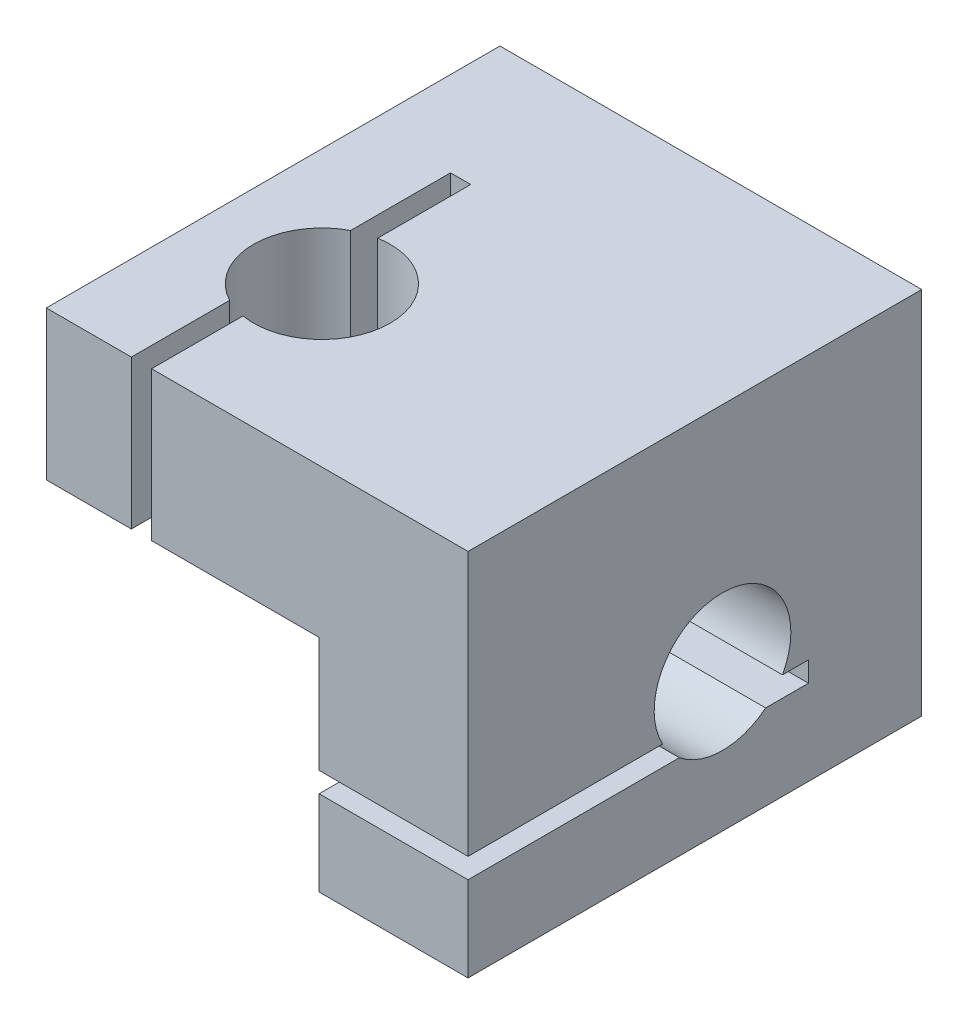
ISO-10303-21;
HEADER;
FILE_DESCRIPTION(('STEP AP214'),'2;1');
FILE_NAME('part.step','',(''),(''),'','','');
FILE_SCHEMA(('AUTOMOTIVE_DESIGN { 1 0 10303 214 1 1 1 1 }'));
ENDSEC;
DATA;
#1=APPLICATION_CONTEXT('core data for automotive mechanical design processes');
#2=APPLICATION_PROTOCOL_DEFINITION('international standard','automotive_design',2000,#1);
#3=PRODUCT_CONTEXT('',#1,'mechanical');
#4=PRODUCT('Part','Part','',(#3));
#5=PRODUCT_RELATED_PRODUCT_CATEGORY('part','',(#4));
#6=PRODUCT_DEFINITION_FORMATION('','',#4);
#7=PRODUCT_DEFINITION_CONTEXT('part definition',#1,'design');
#8=PRODUCT_DEFINITION('design','',#6,#7);
#9=PRODUCT_DEFINITION_SHAPE('','',#8);
#10=(LENGTH_UNIT() NAMED_UNIT(*) SI_UNIT(.MILLI.,.METRE.));
#11=(NAMED_UNIT(*) PLANE_ANGLE_UNIT() SI_UNIT($,.RADIAN.));
#12=(NAMED_UNIT(*) SI_UNIT($,.STERADIAN.) SOLID_ANGLE_UNIT());
#13=UNCERTAINTY_MEASURE_WITH_UNIT(LENGTH_MEASURE(1.E-05),#10,'distance_accuracy_value','');
#14=(GEOMETRIC_REPRESENTATION_CONTEXT(3) GLOBAL_UNCERTAINTY_ASSIGNED_CONTEXT((#13)) GLOBAL_UNIT_ASSIGNED_CONTEXT((#10,
#11,#12)) REPRESENTATION_CONTEXT('',''));
#15=CARTESIAN_POINT('',(0.,0.,0.));
#16=DIRECTION('',(0.,0.,1.));
#17=DIRECTION('',(1.,0.,0.));
#18=AXIS2_PLACEMENT_3D('',#15,#16,#17);
#19=CARTESIAN_POINT('',(0.,0.,42.65));
#20=DIRECTION('',(0.,0.,1.));
#21=DIRECTION('',(1.,0.,0.));
#22=AXIS2_PLACEMENT_3D('',#19,#20,#21);
#23=PLANE('',#22);
#24=DIRECTION('',(-1.,0.,0.));
#25=VECTOR('',#24,1.);
#26=CARTESIAN_POINT('',(42.65,-26.73,42.65));
#27=LINE('',#26,#25);
#28=CARTESIAN_POINT('',(14.,-26.73,42.65));
#29=VERTEX_POINT('',#28);
#30=CARTESIAN_POINT('',(0.,-26.73,42.65));
#31=VERTEX_POINT('',#30);
#32=EDGE_CURVE('E259',#29,#31,#27,.T.);
#33=ORIENTED_EDGE('',*,*,#32,.T.);
#34=DIRECTION('',(0.,-1.,0.));
#35=VECTOR('',#34,1.);
#36=CARTESIAN_POINT('',(0.,0.,42.65));
#37=LINE('',#36,#35);
#38=CARTESIAN_POINT('',(0.,-34.73,42.65));
#39=VERTEX_POINT('',#38);
#40=EDGE_CURVE('E346',#31,#39,#37,.T.);
#41=ORIENTED_EDGE('',*,*,#40,.T.);
#42=DIRECTION('',(1.,0.,0.));
#43=VECTOR('',#42,1.);
#44=CARTESIAN_POINT('',(0.,-34.73,42.65));
#45=LINE('',#44,#43);
#46=CARTESIAN_POINT('',(14.,-34.73,42.65));
#47=VERTEX_POINT('',#46);
#48=EDGE_CURVE('E351',#39,#47,#45,.T.);
#49=ORIENTED_EDGE('',*,*,#48,.T.);
#50=DIRECTION('',(0.,-1.,0.));
#51=VECTOR('',#50,1.);
#52=CARTESIAN_POINT('',(14.,0.,42.65));
#53=LINE('',#52,#51);
#54=EDGE_CURVE('E355',#29,#47,#53,.T.);
#55=ORIENTED_EDGE('',*,*,#54,.F.);
#56=EDGE_LOOP('',(#33,#41,#49,#55));
#57=FACE_BOUND('',#56,.T.);
#58=ADVANCED_FACE('F47',(#57),#23,.T.);
#59=CARTESIAN_POINT('',(42.65,-21.745,18.725));
#60=DIRECTION('',(-1.,0.,0.));
#61=DIRECTION('',(0.,-1.,0.));
#62=AXIS2_PLACEMENT_3D('',#59,#60,#61);
#63=CYLINDRICAL_SURFACE('',#62,6.425);
#64=CARTESIAN_POINT('',(0.,-21.745,18.725));
#65=DIRECTION('',(-1.,0.,0.));
#66=DIRECTION('',(0.,-1.,0.));
#67=AXIS2_PLACEMENT_3D('',#64,#65,#66);
#68=CIRCLE('',#67,6.425);
#69=CARTESIAN_POINT('',(0.,-26.73,14.6715570190269));
#70=VERTEX_POINT('',#69);
#71=CARTESIAN_POINT('',(0.,-26.73,22.7784429809731));
#72=VERTEX_POINT('',#71);
#73=EDGE_CURVE('E278',#70,#72,#68,.T.);
#74=ORIENTED_EDGE('',*,*,#73,.T.);
#75=DIRECTION('',(-1.,0.,0.));
#76=VECTOR('',#75,1.);
#77=CARTESIAN_POINT('',(42.65,-26.73,22.7784429809731));
#78=LINE('',#77,#76);
#79=CARTESIAN_POINT('',(14.,-26.73,22.7784429809731));
#80=VERTEX_POINT('',#79);
#81=EDGE_CURVE('E56',#72,#80,#78,.F.);
#82=ORIENTED_EDGE('',*,*,#81,.T.);
#83=CARTESIAN_POINT('',(14.,-21.745,18.725));
#84=DIRECTION('',(1.,0.,0.));
#85=DIRECTION('',(0.,1.,0.));
#86=AXIS2_PLACEMENT_3D('',#83,#84,#85);
#87=CIRCLE('',#86,6.425);
#88=CARTESIAN_POINT('',(14.,-26.73,14.6715570190269));
#89=VERTEX_POINT('',#88);
#90=EDGE_CURVE('E424',#80,#89,#87,.T.);
#91=ORIENTED_EDGE('',*,*,#90,.T.);
#92=DIRECTION('',(-1.,0.,0.));
#93=VECTOR('',#92,1.);
#94=CARTESIAN_POINT('',(42.65,-26.73,14.6715570190269));
#95=LINE('',#94,#93);
#96=EDGE_CURVE('E430',#89,#70,#95,.T.);
#97=ORIENTED_EDGE('',*,*,#96,.T.);
#98=EDGE_LOOP('',(#74,#82,#91,#97));
#99=FACE_BOUND('',#98,.T.);
#100=ADVANCED_FACE('F438',(#99),#63,.F.);
#101=DIRECTION('',(0.,-1.,0.));
#102=VECTOR('',#101,1.);
#103=CARTESIAN_POINT('',(-17.65,28.65,42.65));
#104=LINE('',#103,#102);
#105=CARTESIAN_POINT('',(-17.65,0.,42.65));
#106=VERTEX_POINT('',#105);
#107=CARTESIAN_POINT('',(-17.65,-14.,42.65));
#108=VERTEX_POINT('',#107);
#109=EDGE_CURVE('E296',#106,#108,#104,.T.);
#110=ORIENTED_EDGE('',*,*,#109,.F.);
#111=DIRECTION('',(-1.,0.,0.));
#112=VECTOR('',#111,1.);
#113=CARTESIAN_POINT('',(0.,0.,42.65));
#114=LINE('',#113,#112);
#115=CARTESIAN_POINT('',(-25.65,0.,42.65));
#116=VERTEX_POINT('',#115);
#117=EDGE_CURVE('E337',#106,#116,#114,.T.);
#118=ORIENTED_EDGE('',*,*,#117,.T.);
#119=DIRECTION('',(0.,-1.,0.));
#120=VECTOR('',#119,1.);
#121=CARTESIAN_POINT('',(-25.65,0.,42.65));
#122=LINE('',#121,#120);
#123=CARTESIAN_POINT('',(-25.65,-14.,42.65));
#124=VERTEX_POINT('',#123);
#125=EDGE_CURVE('E336',#116,#124,#122,.T.);
#126=ORIENTED_EDGE('',*,*,#125,.T.);
#127=DIRECTION('',(-1.,0.,0.));
#128=VECTOR('',#127,1.);
#129=CARTESIAN_POINT('',(0.,-14.,42.65));
#130=LINE('',#129,#128);
#131=EDGE_CURVE('E341',#108,#124,#130,.T.);
#132=ORIENTED_EDGE('',*,*,#131,.F.);
#133=EDGE_LOOP('',(#110,#118,#126,#132));
#134=FACE_BOUND('',#133,.T.);
#135=ADVANCED_FACE('F517',(#134),#23,.T.);
#136=CARTESIAN_POINT('',(-14.665,28.65,27.725));
#137=DIRECTION('',(0.,-1.,0.));
#138=DIRECTION('',(1.,0.,0.));
#139=AXIS2_PLACEMENT_3D('',#136,#137,#138);
#140=CYLINDRICAL_SURFACE('',#139,6.425);
#141=CARTESIAN_POINT('',(-14.665,-14.,27.725));
#142=DIRECTION('',(0.,-1.,0.));
#143=DIRECTION('',(1.,0.,0.));
#144=AXIS2_PLACEMENT_3D('',#141,#142,#143);
#145=CIRCLE('',#144,6.425);
#146=CARTESIAN_POINT('',(-17.65,-14.,33.4144990992178));
#147=VERTEX_POINT('',#146);
#148=CARTESIAN_POINT('',(-17.65,-14.,22.0355009007822));
#149=VERTEX_POINT('',#148);
#150=EDGE_CURVE('E326',#147,#149,#145,.T.);
#151=ORIENTED_EDGE('',*,*,#150,.T.);
#152=DIRECTION('',(0.,-1.,0.));
#153=VECTOR('',#152,1.);
#154=CARTESIAN_POINT('',(-17.65,28.65,22.0355009007822));
#155=LINE('',#154,#153);
#156=CARTESIAN_POINT('',(-17.65,0.,22.0355009007822));
#157=VERTEX_POINT('',#156);
#158=EDGE_CURVE('E415',#149,#157,#155,.F.);
#159=ORIENTED_EDGE('',*,*,#158,.T.);
#160=CARTESIAN_POINT('',(-14.665,0.,27.725));
#161=DIRECTION('',(0.,-1.,0.));
#162=DIRECTION('',(1.,0.,0.));
#163=AXIS2_PLACEMENT_3D('',#160,#161,#162);
#164=CIRCLE('',#163,6.425);
#165=CARTESIAN_POINT('',(-17.65,0.,33.4144990992178));
#166=VERTEX_POINT('',#165);
#167=EDGE_CURVE('E331',#166,#157,#164,.T.);
#168=ORIENTED_EDGE('',*,*,#167,.F.);
#169=DIRECTION('',(0.,-1.,0.));
#170=VECTOR('',#169,1.);
#171=CARTESIAN_POINT('',(-17.65,28.65,33.4144990992178));
#172=LINE('',#171,#170);
#173=EDGE_CURVE('E411',#166,#147,#172,.T.);
#174=ORIENTED_EDGE('',*,*,#173,.T.);
#175=EDGE_LOOP('',(#151,#159,#168,#174));
#176=FACE_BOUND('',#175,.T.);
#177=ADVANCED_FACE('F510',(#176),#140,.F.);
#178=CARTESIAN_POINT('',(0.,0.,42.65));
#179=DIRECTION('',(0.,-1.,0.));
#180=DIRECTION('',(1.,0.,0.));
#181=AXIS2_PLACEMENT_3D('',#178,#179,#180);
#182=PLANE('',#181);
#183=ORIENTED_EDGE('',*,*,#117,.F.);
#184=DIRECTION('',(0.,0.,-1.));
#185=VECTOR('',#184,1.);
#186=CARTESIAN_POINT('',(-17.65,0.,42.65));
#187=LINE('',#186,#185);
#188=EDGE_CURVE('E313',#106,#166,#187,.T.);
#189=ORIENTED_EDGE('',*,*,#188,.T.);
#190=ORIENTED_EDGE('',*,*,#167,.T.);
#191=CARTESIAN_POINT('',(-17.65,0.,12.65));
#192=VERTEX_POINT('',#191);
#193=EDGE_CURVE('E317',#157,#192,#187,.T.);
#194=ORIENTED_EDGE('',*,*,#193,.T.);
#195=DIRECTION('',(1.,0.,0.));
#196=VECTOR('',#195,1.);
#197=CARTESIAN_POINT('',(0.,0.,12.65));
#198=LINE('',#197,#196);
#199=CARTESIAN_POINT('',(-15.75,0.,12.65));
#200=VERTEX_POINT('',#199);
#201=EDGE_CURVE('E318',#192,#200,#198,.T.);
#202=ORIENTED_EDGE('',*,*,#201,.T.);
#203=DIRECTION('',(0.,0.,1.));
#204=VECTOR('',#203,1.);
#205=CARTESIAN_POINT('',(-15.75,0.,42.65));
#206=LINE('',#205,#204);
#207=CARTESIAN_POINT('',(-15.75,0.,21.3922754678575));
#208=VERTEX_POINT('',#207);
#209=EDGE_CURVE('E299',#200,#208,#206,.T.);
#210=ORIENTED_EDGE('',*,*,#209,.T.);
#211=CARTESIAN_POINT('',(-15.75,0.,34.0577245321425));
#212=VERTEX_POINT('',#211);
#213=EDGE_CURVE('E327',#208,#212,#164,.T.);
#214=ORIENTED_EDGE('',*,*,#213,.T.);
#215=CARTESIAN_POINT('',(-15.75,0.,42.65));
#216=VERTEX_POINT('',#215);
#217=EDGE_CURVE('E312',#212,#216,#206,.T.);
#218=ORIENTED_EDGE('',*,*,#217,.T.);
#219=CARTESIAN_POINT('',(14.,0.,42.65));
#220=VERTEX_POINT('',#219);
#221=EDGE_CURVE('E332',#220,#216,#114,.T.);
#222=ORIENTED_EDGE('',*,*,#221,.F.);
#223=DIRECTION('',(0.,0.,-1.));
#224=VECTOR('',#223,1.);
#225=CARTESIAN_POINT('',(14.,0.,42.65));
#226=LINE('',#225,#224);
#227=CARTESIAN_POINT('',(14.,0.,0.));
#228=VERTEX_POINT('',#227);
#229=EDGE_CURVE('E360',#220,#228,#226,.T.);
#230=ORIENTED_EDGE('',*,*,#229,.T.);
#231=DIRECTION('',(-1.,0.,0.));
#232=VECTOR('',#231,1.);
#233=CARTESIAN_POINT('',(0.,0.,0.));
#234=LINE('',#233,#232);
#235=CARTESIAN_POINT('',(-25.65,0.,0.));
#236=VERTEX_POINT('',#235);
#237=EDGE_CURVE('E361',#228,#236,#234,.T.);
#238=ORIENTED_EDGE('',*,*,#237,.T.);
#239=DIRECTION('',(0.,0.,-1.));
#240=VECTOR('',#239,1.);
#241=CARTESIAN_POINT('',(-25.65,0.,42.65));
#242=LINE('',#241,#240);
#243=EDGE_CURVE('E399',#116,#236,#242,.T.);
#244=ORIENTED_EDGE('',*,*,#243,.F.);
#245=EDGE_LOOP('',(#183,#189,#190,#194,#202,#210,#214,#218,#222,#230,#238,#244));
#246=FACE_BOUND('',#245,.T.);
#247=ADVANCED_FACE('F49',(#246),#182,.F.);
#248=CARTESIAN_POINT('',(-25.65,0.,42.65));
#249=DIRECTION('',(1.,0.,0.));
#250=DIRECTION('',(0.,1.,0.));
#251=AXIS2_PLACEMENT_3D('',#248,#249,#250);
#252=PLANE('',#251);
#253=DIRECTION('',(0.,-1.,0.));
#254=VECTOR('',#253,1.);
#255=CARTESIAN_POINT('',(-25.65,0.,0.));
#256=LINE('',#255,#254);
#257=CARTESIAN_POINT('',(-25.65,-14.,0.));
#258=VERTEX_POINT('',#257);
#259=EDGE_CURVE('E365',#236,#258,#256,.T.);
#260=ORIENTED_EDGE('',*,*,#259,.T.);
#261=DIRECTION('',(0.,0.,-1.));
#262=VECTOR('',#261,1.);
#263=CARTESIAN_POINT('',(-25.65,-14.,42.65));
#264=LINE('',#263,#262);
#265=EDGE_CURVE('E396',#124,#258,#264,.T.);
#266=ORIENTED_EDGE('',*,*,#265,.F.);
#267=ORIENTED_EDGE('',*,*,#125,.F.);
#268=ORIENTED_EDGE('',*,*,#243,.T.);
#269=EDGE_LOOP('',(#260,#266,#267,#268));
#270=FACE_BOUND('',#269,.T.);
#271=ADVANCED_FACE('F542',(#270),#252,.F.);
#272=CARTESIAN_POINT('',(0.,-14.,42.65));
#273=DIRECTION('',(0.,-1.,0.));
#274=DIRECTION('',(1.,0.,0.));
#275=AXIS2_PLACEMENT_3D('',#272,#273,#274);
#276=PLANE('',#275);
#277=DIRECTION('',(0.,0.,-1.));
#278=VECTOR('',#277,1.);
#279=CARTESIAN_POINT('',(-17.65,-14.,42.65));
#280=LINE('',#279,#278);
#281=EDGE_CURVE('E283',#108,#147,#280,.T.);
#282=ORIENTED_EDGE('',*,*,#281,.F.);
#283=ORIENTED_EDGE('',*,*,#131,.T.);
#284=ORIENTED_EDGE('',*,*,#265,.T.);
#285=DIRECTION('',(-1.,0.,0.));
#286=VECTOR('',#285,1.);
#287=CARTESIAN_POINT('',(0.,-14.,0.));
#288=LINE('',#287,#286);
#289=CARTESIAN_POINT('',(0.,-14.,0.));
#290=VERTEX_POINT('',#289);
#291=EDGE_CURVE('E369',#290,#258,#288,.T.);
#292=ORIENTED_EDGE('',*,*,#291,.F.);
#293=DIRECTION('',(0.,0.,-1.));
#294=VECTOR('',#293,1.);
#295=CARTESIAN_POINT('',(0.,-14.,42.65));
#296=LINE('',#295,#294);
#297=CARTESIAN_POINT('',(0.,-14.,42.65));
#298=VERTEX_POINT('',#297);
#299=EDGE_CURVE('E393',#298,#290,#296,.T.);
#300=ORIENTED_EDGE('',*,*,#299,.F.);
#301=CARTESIAN_POINT('',(-15.75,-14.,42.65));
#302=VERTEX_POINT('',#301);
#303=EDGE_CURVE('E342',#298,#302,#130,.T.);
#304=ORIENTED_EDGE('',*,*,#303,.T.);
#305=DIRECTION('',(0.,0.,1.));
#306=VECTOR('',#305,1.);
#307=CARTESIAN_POINT('',(-15.75,-14.,42.65));
#308=LINE('',#307,#306);
#309=CARTESIAN_POINT('',(-15.75,-14.,34.0577245321425));
#310=VERTEX_POINT('',#309);
#311=EDGE_CURVE('E291',#310,#302,#308,.T.);
#312=ORIENTED_EDGE('',*,*,#311,.F.);
#313=CARTESIAN_POINT('',(-15.75,-14.,21.3922754678575));
#314=VERTEX_POINT('',#313);
#315=EDGE_CURVE('E322',#314,#310,#145,.T.);
#316=ORIENTED_EDGE('',*,*,#315,.F.);
#317=CARTESIAN_POINT('',(-15.75,-14.,12.65));
#318=VERTEX_POINT('',#317);
#319=EDGE_CURVE('E292',#318,#314,#308,.T.);
#320=ORIENTED_EDGE('',*,*,#319,.F.);
#321=DIRECTION('',(1.,0.,0.));
#322=VECTOR('',#321,1.);
#323=CARTESIAN_POINT('',(-17.65,-14.,12.65));
#324=LINE('',#323,#322);
#325=CARTESIAN_POINT('',(-17.65,-14.,12.65));
#326=VERTEX_POINT('',#325);
#327=EDGE_CURVE('E286',#326,#318,#324,.T.);
#328=ORIENTED_EDGE('',*,*,#327,.F.);
#329=EDGE_CURVE('E287',#149,#326,#280,.T.);
#330=ORIENTED_EDGE('',*,*,#329,.F.);
#331=ORIENTED_EDGE('',*,*,#150,.F.);
#332=EDGE_LOOP('',(#282,#283,#284,#292,#300,#304,#312,#316,#320,#328,#330,#331));
#333=FACE_BOUND('',#332,.T.);
#334=ADVANCED_FACE('F462',(#333),#276,.T.);
#335=CARTESIAN_POINT('',(0.,0.,42.65));
#336=DIRECTION('',(1.,0.,0.));
#337=DIRECTION('',(0.,1.,0.));
#338=AXIS2_PLACEMENT_3D('',#335,#336,#337);
#339=PLANE('',#338);
#340=ORIENTED_EDGE('',*,*,#40,.F.);
#341=DIRECTION('',(0.,0.,1.));
#342=VECTOR('',#341,1.);
#343=CARTESIAN_POINT('',(0.,-26.73,42.65));
#344=LINE('',#343,#342);
#345=EDGE_CURVE('E254',#72,#31,#344,.T.);
#346=ORIENTED_EDGE('',*,*,#345,.F.);
#347=ORIENTED_EDGE('',*,*,#73,.F.);
#348=CARTESIAN_POINT('',(0.,-26.73,10.65));
#349=VERTEX_POINT('',#348);
#350=EDGE_CURVE('E255',#349,#70,#344,.T.);
#351=ORIENTED_EDGE('',*,*,#350,.F.);
#352=DIRECTION('',(0.,-1.,0.));
#353=VECTOR('',#352,1.);
#354=CARTESIAN_POINT('',(0.,-26.73,10.65));
#355=LINE('',#354,#353);
#356=CARTESIAN_POINT('',(0.,-24.83,10.65));
#357=VERTEX_POINT('',#356);
#358=EDGE_CURVE('E250',#357,#349,#355,.T.);
#359=ORIENTED_EDGE('',*,*,#358,.F.);
#360=DIRECTION('',(0.,0.,-1.));
#361=VECTOR('',#360,1.);
#362=CARTESIAN_POINT('',(0.,-24.83,42.65));
#363=LINE('',#362,#361);
#364=CARTESIAN_POINT('',(0.,-24.83,13.0890972329182));
#365=VERTEX_POINT('',#364);
#366=EDGE_CURVE('E247',#365,#357,#363,.T.);
#367=ORIENTED_EDGE('',*,*,#366,.F.);
#368=CARTESIAN_POINT('',(0.,-24.83,24.3609027670818));
#369=VERTEX_POINT('',#368);
#370=EDGE_CURVE('E282',#369,#365,#68,.T.);
#371=ORIENTED_EDGE('',*,*,#370,.F.);
#372=CARTESIAN_POINT('',(0.,-24.83,42.65));
#373=VERTEX_POINT('',#372);
#374=EDGE_CURVE('E63',#373,#369,#363,.T.);
#375=ORIENTED_EDGE('',*,*,#374,.F.);
#376=EDGE_CURVE('E347',#298,#373,#37,.T.);
#377=ORIENTED_EDGE('',*,*,#376,.F.);
#378=ORIENTED_EDGE('',*,*,#299,.T.);
#379=DIRECTION('',(0.,-1.,0.));
#380=VECTOR('',#379,1.);
#381=CARTESIAN_POINT('',(0.,0.,0.));
#382=LINE('',#381,#380);
#383=CARTESIAN_POINT('',(0.,-34.73,0.));
#384=VERTEX_POINT('',#383);
#385=EDGE_CURVE('E373',#290,#384,#382,.T.);
#386=ORIENTED_EDGE('',*,*,#385,.T.);
#387=DIRECTION('',(0.,0.,-1.));
#388=VECTOR('',#387,1.);
#389=CARTESIAN_POINT('',(0.,-34.73,42.65));
#390=LINE('',#389,#388);
#391=EDGE_CURVE('E389',#39,#384,#390,.T.);
#392=ORIENTED_EDGE('',*,*,#391,.F.);
#393=EDGE_LOOP('',(#340,#346,#347,#351,#359,#367,#371,#375,#377,#378,#386,#392));
#394=FACE_BOUND('',#393,.T.);
#395=ADVANCED_FACE('F490',(#394),#339,.F.);
#396=CARTESIAN_POINT('',(0.,-34.73,42.65));
#397=DIRECTION('',(0.,1.,0.));
#398=DIRECTION('',(0.,0.,1.));
#399=AXIS2_PLACEMENT_3D('',#396,#397,#398);
#400=PLANE('',#399);
#401=DIRECTION('',(1.,0.,0.));
#402=VECTOR('',#401,1.);
#403=CARTESIAN_POINT('',(0.,-34.73,0.));
#404=LINE('',#403,#402);
#405=CARTESIAN_POINT('',(14.,-34.73,0.));
#406=VERTEX_POINT('',#405);
#407=EDGE_CURVE('E376',#384,#406,#404,.T.);
#408=ORIENTED_EDGE('',*,*,#407,.T.);
#409=DIRECTION('',(0.,0.,-1.));
#410=VECTOR('',#409,1.);
#411=CARTESIAN_POINT('',(14.,-34.73,42.65));
#412=LINE('',#411,#410);
#413=EDGE_CURVE('E386',#47,#406,#412,.T.);
#414=ORIENTED_EDGE('',*,*,#413,.F.);
#415=ORIENTED_EDGE('',*,*,#48,.F.);
#416=ORIENTED_EDGE('',*,*,#391,.T.);
#417=EDGE_LOOP('',(#408,#414,#415,#416));
#418=FACE_BOUND('',#417,.T.);
#419=ADVANCED_FACE('F531',(#418),#400,.F.);
#420=CARTESIAN_POINT('',(14.,0.,42.65));
#421=DIRECTION('',(1.,0.,0.));
#422=DIRECTION('',(0.,1.,0.));
#423=AXIS2_PLACEMENT_3D('',#420,#421,#422);
#424=PLANE('',#423);
#425=DIRECTION('',(0.,0.,-1.));
#426=VECTOR('',#425,1.);
#427=CARTESIAN_POINT('',(14.,-26.73,42.65));
#428=LINE('',#427,#426);
#429=EDGE_CURVE('E277',#29,#80,#428,.T.);
#430=ORIENTED_EDGE('',*,*,#429,.F.);
#431=ORIENTED_EDGE('',*,*,#54,.T.);
#432=ORIENTED_EDGE('',*,*,#413,.T.);
#433=DIRECTION('',(0.,-1.,0.));
#434=VECTOR('',#433,1.);
#435=CARTESIAN_POINT('',(14.,0.,0.));
#436=LINE('',#435,#434);
#437=EDGE_CURVE('E380',#228,#406,#436,.T.);
#438=ORIENTED_EDGE('',*,*,#437,.F.);
#439=ORIENTED_EDGE('',*,*,#229,.F.);
#440=CARTESIAN_POINT('',(14.,-24.83,42.65));
#441=VERTEX_POINT('',#440);
#442=EDGE_CURVE('E356',#220,#441,#53,.T.);
#443=ORIENTED_EDGE('',*,*,#442,.T.);
#444=DIRECTION('',(0.,0.,1.));
#445=VECTOR('',#444,1.);
#446=CARTESIAN_POINT('',(14.,-24.83,42.65));
#447=LINE('',#446,#445);
#448=CARTESIAN_POINT('',(14.,-24.83,24.3609027670818));
#449=VERTEX_POINT('',#448);
#450=EDGE_CURVE('E263',#449,#441,#447,.T.);
#451=ORIENTED_EDGE('',*,*,#450,.F.);
#452=CARTESIAN_POINT('',(14.,-24.83,13.0890972329182));
#453=VERTEX_POINT('',#452);
#454=EDGE_CURVE('E420',#453,#449,#87,.T.);
#455=ORIENTED_EDGE('',*,*,#454,.F.);
#456=CARTESIAN_POINT('',(14.,-24.83,10.65));
#457=VERTEX_POINT('',#456);
#458=EDGE_CURVE('E71',#457,#453,#447,.T.);
#459=ORIENTED_EDGE('',*,*,#458,.F.);
#460=DIRECTION('',(0.,1.,0.));
#461=VECTOR('',#460,1.);
#462=CARTESIAN_POINT('',(14.,0.,10.65));
#463=LINE('',#462,#461);
#464=CARTESIAN_POINT('',(14.,-26.73,10.65));
#465=VERTEX_POINT('',#464);
#466=EDGE_CURVE('E11',#465,#457,#463,.T.);
#467=ORIENTED_EDGE('',*,*,#466,.F.);
#468=EDGE_CURVE('E274',#89,#465,#428,.T.);
#469=ORIENTED_EDGE('',*,*,#468,.F.);
#470=ORIENTED_EDGE('',*,*,#90,.F.);
#471=EDGE_LOOP('',(#430,#431,#432,#438,#439,#443,#451,#455,#459,#467,#469,#470));
#472=FACE_BOUND('',#471,.T.);
#473=ADVANCED_FACE('F445',(#472),#424,.T.);
#474=DIRECTION('',(-1.,0.,0.));
#475=VECTOR('',#474,1.);
#476=CARTESIAN_POINT('',(42.65,-24.83,42.65));
#477=LINE('',#476,#475);
#478=EDGE_CURVE('E258',#441,#373,#477,.T.);
#479=ORIENTED_EDGE('',*,*,#478,.F.);
#480=ORIENTED_EDGE('',*,*,#442,.F.);
#481=ORIENTED_EDGE('',*,*,#221,.T.);
#482=DIRECTION('',(0.,-1.,0.));
#483=VECTOR('',#482,1.);
#484=CARTESIAN_POINT('',(-15.75,28.65,42.65));
#485=LINE('',#484,#483);
#486=EDGE_CURVE('E300',#216,#302,#485,.T.);
#487=ORIENTED_EDGE('',*,*,#486,.T.);
#488=ORIENTED_EDGE('',*,*,#303,.F.);
#489=ORIENTED_EDGE('',*,*,#376,.T.);
#490=EDGE_LOOP('',(#479,#480,#481,#487,#488,#489));
#491=FACE_BOUND('',#490,.T.);
#492=ADVANCED_FACE('F482',(#491),#23,.T.);
#493=CARTESIAN_POINT('',(0.,0.,0.));
#494=DIRECTION('',(0.,0.,1.));
#495=DIRECTION('',(1.,0.,0.));
#496=AXIS2_PLACEMENT_3D('',#493,#494,#495);
#497=PLANE('',#496);
#498=CARTESIAN_POINT('',(-1.10000000000001,-5.25,0.));
#499=DIRECTION('',(0.,0.,-1.));
#500=DIRECTION('',(-1.,0.,0.));
#501=AXIS2_PLACEMENT_3D('',#498,#499,#500);
#502=CIRCLE('',#501,1.525);
#503=CARTESIAN_POINT('',(-2.62500000000001,-5.25,0.));
#504=VERTEX_POINT('',#503);
#505=EDGE_CURVE('E224',#504,#504,#502,.T.);
#506=ORIENTED_EDGE('',*,*,#505,.F.);
#507=EDGE_LOOP('',(#506));
#508=FACE_BOUND('',#507,.T.);
#509=CARTESIAN_POINT('',(-13.5,-5.25,0.));
#510=DIRECTION('',(0.,0.,-1.));
#511=DIRECTION('',(-1.,0.,0.));
#512=AXIS2_PLACEMENT_3D('',#509,#510,#511);
#513=CIRCLE('',#512,1.525);
#514=CARTESIAN_POINT('',(-15.025,-5.25,0.));
#515=VERTEX_POINT('',#514);
#516=EDGE_CURVE('E215',#515,#515,#513,.T.);
#517=ORIENTED_EDGE('',*,*,#516,.F.);
#518=EDGE_LOOP('',(#517));
#519=FACE_BOUND('',#518,.T.);
#520=CARTESIAN_POINT('',(6.98999999999999,-21.8,0.));
#521=DIRECTION('',(0.,0.,-1.));
#522=DIRECTION('',(-1.,0.,0.));
#523=AXIS2_PLACEMENT_3D('',#520,#521,#522);
#524=CIRCLE('',#523,1.525);
#525=CARTESIAN_POINT('',(5.46499999999999,-21.8,0.));
#526=VERTEX_POINT('',#525);
#527=EDGE_CURVE('E235',#526,#526,#524,.T.);
#528=ORIENTED_EDGE('',*,*,#527,.F.);
#529=EDGE_LOOP('',(#528));
#530=FACE_BOUND('',#529,.T.);
#531=ORIENTED_EDGE('',*,*,#237,.F.);
#532=ORIENTED_EDGE('',*,*,#437,.T.);
#533=ORIENTED_EDGE('',*,*,#407,.F.);
#534=ORIENTED_EDGE('',*,*,#385,.F.);
#535=ORIENTED_EDGE('',*,*,#291,.T.);
#536=ORIENTED_EDGE('',*,*,#259,.F.);
#537=EDGE_LOOP('',(#531,#532,#533,#534,#535,#536));
#538=FACE_BOUND('',#537,.T.);
#539=ADVANCED_FACE('F508',(#508,#519,#530,#538),#497,.F.);
#540=ORIENTED_EDGE('',*,*,#315,.T.);
#541=DIRECTION('',(0.,-1.,0.));
#542=VECTOR('',#541,1.);
#543=CARTESIAN_POINT('',(-15.75,28.65,34.0577245321425));
#544=LINE('',#543,#542);
#545=EDGE_CURVE('E407',#310,#212,#544,.F.);
#546=ORIENTED_EDGE('',*,*,#545,.T.);
#547=ORIENTED_EDGE('',*,*,#213,.F.);
#548=DIRECTION('',(0.,-1.,0.));
#549=VECTOR('',#548,1.);
#550=CARTESIAN_POINT('',(-15.75,28.65,21.3922754678575));
#551=LINE('',#550,#549);
#552=EDGE_CURVE('E403',#208,#314,#551,.T.);
#553=ORIENTED_EDGE('',*,*,#552,.T.);
#554=EDGE_LOOP('',(#540,#546,#547,#553));
#555=FACE_BOUND('',#554,.T.);
#556=ADVANCED_FACE('F497',(#555),#140,.F.);
#557=CARTESIAN_POINT('',(-15.75,28.65,42.65));
#558=DIRECTION('',(1.,0.,0.));
#559=DIRECTION('',(0.,1.,0.));
#560=AXIS2_PLACEMENT_3D('',#557,#558,#559);
#561=PLANE('',#560);
#562=DIRECTION('',(0.,-1.,0.));
#563=VECTOR('',#562,1.);
#564=CARTESIAN_POINT('',(-15.75,28.65,12.65));
#565=LINE('',#564,#563);
#566=EDGE_CURVE('E304',#200,#318,#565,.T.);
#567=ORIENTED_EDGE('',*,*,#566,.T.);
#568=ORIENTED_EDGE('',*,*,#319,.T.);
#569=ORIENTED_EDGE('',*,*,#552,.F.);
#570=ORIENTED_EDGE('',*,*,#209,.F.);
#571=EDGE_LOOP('',(#567,#568,#569,#570));
#572=FACE_BOUND('',#571,.T.);
#573=ADVANCED_FACE('F499',(#572),#561,.F.);
#574=CARTESIAN_POINT('',(-17.65,28.65,42.65));
#575=DIRECTION('',(-1.,0.,0.));
#576=DIRECTION('',(0.,-1.,0.));
#577=AXIS2_PLACEMENT_3D('',#574,#575,#576);
#578=PLANE('',#577);
#579=ORIENTED_EDGE('',*,*,#158,.F.);
#580=ORIENTED_EDGE('',*,*,#329,.T.);
#581=DIRECTION('',(0.,-1.,0.));
#582=VECTOR('',#581,1.);
#583=CARTESIAN_POINT('',(-17.65,28.65,12.65));
#584=LINE('',#583,#582);
#585=EDGE_CURVE('E295',#192,#326,#584,.T.);
#586=ORIENTED_EDGE('',*,*,#585,.F.);
#587=ORIENTED_EDGE('',*,*,#193,.F.);
#588=EDGE_LOOP('',(#579,#580,#586,#587));
#589=FACE_BOUND('',#588,.T.);
#590=ADVANCED_FACE('F455',(#589),#578,.F.);
#591=CARTESIAN_POINT('',(-17.65,28.65,12.65));
#592=DIRECTION('',(0.,0.,-1.));
#593=DIRECTION('',(-1.,0.,0.));
#594=AXIS2_PLACEMENT_3D('',#591,#592,#593);
#595=PLANE('',#594);
#596=ORIENTED_EDGE('',*,*,#585,.T.);
#597=ORIENTED_EDGE('',*,*,#327,.T.);
#598=ORIENTED_EDGE('',*,*,#566,.F.);
#599=ORIENTED_EDGE('',*,*,#201,.F.);
#600=EDGE_LOOP('',(#596,#597,#598,#599));
#601=FACE_BOUND('',#600,.T.);
#602=ADVANCED_FACE('F466',(#601),#595,.F.);
#603=ORIENTED_EDGE('',*,*,#545,.F.);
#604=ORIENTED_EDGE('',*,*,#311,.T.);
#605=ORIENTED_EDGE('',*,*,#486,.F.);
#606=ORIENTED_EDGE('',*,*,#217,.F.);
#607=EDGE_LOOP('',(#603,#604,#605,#606));
#608=FACE_BOUND('',#607,.T.);
#609=ADVANCED_FACE('F478',(#608),#561,.F.);
#610=ORIENTED_EDGE('',*,*,#109,.T.);
#611=ORIENTED_EDGE('',*,*,#281,.T.);
#612=ORIENTED_EDGE('',*,*,#173,.F.);
#613=ORIENTED_EDGE('',*,*,#188,.F.);
#614=EDGE_LOOP('',(#610,#611,#612,#613));
#615=FACE_BOUND('',#614,.T.);
#616=ADVANCED_FACE('F507',(#615),#578,.F.);
#617=ORIENTED_EDGE('',*,*,#370,.T.);
#618=DIRECTION('',(-1.,0.,0.));
#619=VECTOR('',#618,1.);
#620=CARTESIAN_POINT('',(42.65,-24.83,13.0890972329182));
#621=LINE('',#620,#619);
#622=EDGE_CURVE('E427',#365,#453,#621,.F.);
#623=ORIENTED_EDGE('',*,*,#622,.T.);
#624=ORIENTED_EDGE('',*,*,#454,.T.);
#625=DIRECTION('',(-1.,0.,0.));
#626=VECTOR('',#625,1.);
#627=CARTESIAN_POINT('',(42.65,-24.83,24.3609027670818));
#628=LINE('',#627,#626);
#629=EDGE_CURVE('E419',#449,#369,#628,.T.);
#630=ORIENTED_EDGE('',*,*,#629,.T.);
#631=EDGE_LOOP('',(#617,#623,#624,#630));
#632=FACE_BOUND('',#631,.T.);
#633=ADVANCED_FACE('F521',(#632),#63,.F.);
#634=CARTESIAN_POINT('',(42.65,-24.83,42.65));
#635=DIRECTION('',(0.,1.,0.));
#636=DIRECTION('',(0.,0.,1.));
#637=AXIS2_PLACEMENT_3D('',#634,#635,#636);
#638=PLANE('',#637);
#639=ORIENTED_EDGE('',*,*,#450,.T.);
#640=ORIENTED_EDGE('',*,*,#478,.T.);
#641=ORIENTED_EDGE('',*,*,#374,.T.);
#642=ORIENTED_EDGE('',*,*,#629,.F.);
#643=EDGE_LOOP('',(#639,#640,#641,#642));
#644=FACE_BOUND('',#643,.T.);
#645=ADVANCED_FACE('F569',(#644),#638,.F.);
#646=ORIENTED_EDGE('',*,*,#458,.T.);
#647=ORIENTED_EDGE('',*,*,#622,.F.);
#648=ORIENTED_EDGE('',*,*,#366,.T.);
#649=DIRECTION('',(-1.,0.,0.));
#650=VECTOR('',#649,1.);
#651=CARTESIAN_POINT('',(42.65,-24.83,10.65));
#652=LINE('',#651,#650);
#653=EDGE_CURVE('E267',#457,#357,#652,.T.);
#654=ORIENTED_EDGE('',*,*,#653,.F.);
#655=EDGE_LOOP('',(#646,#647,#648,#654));
#656=FACE_BOUND('',#655,.T.);
#657=ADVANCED_FACE('F628',(#656),#638,.F.);
#658=CARTESIAN_POINT('',(42.65,-26.73,42.65));
#659=DIRECTION('',(0.,-1.,0.));
#660=DIRECTION('',(0.,0.,-1.));
#661=AXIS2_PLACEMENT_3D('',#658,#659,#660);
#662=PLANE('',#661);
#663=ORIENTED_EDGE('',*,*,#468,.T.);
#664=DIRECTION('',(-1.,0.,0.));
#665=VECTOR('',#664,1.);
#666=CARTESIAN_POINT('',(42.65,-26.73,10.65));
#667=LINE('',#666,#665);
#668=EDGE_CURVE('E264',#465,#349,#667,.T.);
#669=ORIENTED_EDGE('',*,*,#668,.T.);
#670=ORIENTED_EDGE('',*,*,#350,.T.);
#671=ORIENTED_EDGE('',*,*,#96,.F.);
#672=EDGE_LOOP('',(#663,#669,#670,#671));
#673=FACE_BOUND('',#672,.T.);
#674=ADVANCED_FACE('F637',(#673),#662,.F.);
#675=CARTESIAN_POINT('',(42.65,-26.73,10.65));
#676=DIRECTION('',(0.,0.,-1.));
#677=DIRECTION('',(-1.,0.,0.));
#678=AXIS2_PLACEMENT_3D('',#675,#676,#677);
#679=PLANE('',#678);
#680=ORIENTED_EDGE('',*,*,#466,.T.);
#681=ORIENTED_EDGE('',*,*,#653,.T.);
#682=ORIENTED_EDGE('',*,*,#358,.T.);
#683=ORIENTED_EDGE('',*,*,#668,.F.);
#684=EDGE_LOOP('',(#680,#681,#682,#683));
#685=FACE_BOUND('',#684,.T.);
#686=ADVANCED_FACE('F645',(#685),#679,.F.);
#687=ORIENTED_EDGE('',*,*,#429,.T.);
#688=ORIENTED_EDGE('',*,*,#81,.F.);
#689=ORIENTED_EDGE('',*,*,#345,.T.);
#690=ORIENTED_EDGE('',*,*,#32,.F.);
#691=EDGE_LOOP('',(#687,#688,#689,#690));
#692=FACE_BOUND('',#691,.T.);
#693=ADVANCED_FACE('F648',(#692),#662,.F.);
#694=CARTESIAN_POINT('',(6.98999999999999,-21.8,10.));
#695=DIRECTION('',(0.,0.,-1.));
#696=DIRECTION('',(-1.,0.,0.));
#697=AXIS2_PLACEMENT_3D('',#694,#695,#696);
#698=CONICAL_SURFACE('',#697,1.24999999999999,1.02974425867665);
#699=CARTESIAN_POINT('',(6.98999999999999,-21.8,10.7510757737845));
#700=VERTEX_POINT('',#699);
#701=VERTEX_LOOP('',#700);
#702=FACE_BOUND('',#701,.T.);
#703=CARTESIAN_POINT('',(6.98999999999999,-21.8,10.));
#704=DIRECTION('',(0.,0.,-1.));
#705=DIRECTION('',(-1.,0.,0.));
#706=AXIS2_PLACEMENT_3D('',#703,#704,#705);
#707=CIRCLE('',#706,1.24999999999999);
#708=CARTESIAN_POINT('',(5.73999999999999,-21.8,10.));
#709=VERTEX_POINT('',#708);
#710=EDGE_CURVE('E243',#709,#709,#707,.T.);
#711=ORIENTED_EDGE('',*,*,#710,.T.);
#712=EDGE_LOOP('',(#711));
#713=FACE_BOUND('',#712,.T.);
#714=ADVANCED_FACE('F665',(#702,#713),#698,.F.);
#715=CARTESIAN_POINT('',(6.98999999999999,-21.8,0.));
#716=DIRECTION('',(0.,0.,-1.));
#717=DIRECTION('',(-1.,0.,0.));
#718=AXIS2_PLACEMENT_3D('',#715,#716,#717);
#719=CYLINDRICAL_SURFACE('',#718,1.24999999999999);
#720=ORIENTED_EDGE('',*,*,#710,.F.);
#721=EDGE_LOOP('',(#720));
#722=FACE_BOUND('',#721,.T.);
#723=CARTESIAN_POINT('',(6.98999999999999,-21.8,0.275000000000004));
#724=DIRECTION('',(0.,0.,-1.));
#725=DIRECTION('',(-1.,0.,0.));
#726=AXIS2_PLACEMENT_3D('',#723,#724,#725);
#727=CIRCLE('',#726,1.25);
#728=CARTESIAN_POINT('',(5.73999999999999,-21.8,0.275000000000004));
#729=VERTEX_POINT('',#728);
#730=EDGE_CURVE('E239',#729,#729,#727,.T.);
#731=ORIENTED_EDGE('',*,*,#730,.T.);
#732=EDGE_LOOP('',(#731));
#733=FACE_BOUND('',#732,.T.);
#734=ADVANCED_FACE('F684',(#722,#733),#719,.F.);
#735=CARTESIAN_POINT('',(6.98999999999999,-21.8,0.));
#736=DIRECTION('',(0.,0.,-1.));
#737=DIRECTION('',(-1.,0.,0.));
#738=AXIS2_PLACEMENT_3D('',#735,#736,#737);
#739=CONICAL_SURFACE('',#738,1.525,0.785398163397445);
#740=ORIENTED_EDGE('',*,*,#730,.F.);
#741=EDGE_LOOP('',(#740));
#742=FACE_BOUND('',#741,.T.);
#743=ORIENTED_EDGE('',*,*,#527,.T.);
#744=EDGE_LOOP('',(#743));
#745=FACE_BOUND('',#744,.T.);
#746=ADVANCED_FACE('F695',(#742,#745),#739,.F.);
#747=CARTESIAN_POINT('',(-13.5,-5.25,10.));
#748=DIRECTION('',(0.,0.,-1.));
#749=DIRECTION('',(-1.,0.,0.));
#750=AXIS2_PLACEMENT_3D('',#747,#748,#749);
#751=CONICAL_SURFACE('',#750,1.24999999999999,1.02974425867665);
#752=CARTESIAN_POINT('',(-13.5,-5.25,10.7510757737845));
#753=VERTEX_POINT('',#752);
#754=VERTEX_LOOP('',#753);
#755=FACE_BOUND('',#754,.T.);
#756=CARTESIAN_POINT('',(-13.5,-5.25,10.));
#757=DIRECTION('',(0.,0.,-1.));
#758=DIRECTION('',(-1.,0.,0.));
#759=AXIS2_PLACEMENT_3D('',#756,#757,#758);
#760=CIRCLE('',#759,1.24999999999999);
#761=CARTESIAN_POINT('',(-14.75,-5.25,10.));
#762=VERTEX_POINT('',#761);
#763=EDGE_CURVE('E231',#762,#762,#760,.T.);
#764=ORIENTED_EDGE('',*,*,#763,.T.);
#765=EDGE_LOOP('',(#764));
#766=FACE_BOUND('',#765,.T.);
#767=ADVANCED_FACE('F707',(#755,#766),#751,.F.);
#768=CARTESIAN_POINT('',(-13.5,-5.25,0.));
#769=DIRECTION('',(0.,0.,-1.));
#770=DIRECTION('',(-1.,0.,0.));
#771=AXIS2_PLACEMENT_3D('',#768,#769,#770);
#772=CYLINDRICAL_SURFACE('',#771,1.24999999999999);
#773=ORIENTED_EDGE('',*,*,#763,.F.);
#774=EDGE_LOOP('',(#773));
#775=FACE_BOUND('',#774,.T.);
#776=CARTESIAN_POINT('',(-13.5,-5.25,0.275000000000004));
#777=DIRECTION('',(0.,0.,-1.));
#778=DIRECTION('',(-1.,0.,0.));
#779=AXIS2_PLACEMENT_3D('',#776,#777,#778);
#780=CIRCLE('',#779,1.24999999999999);
#781=CARTESIAN_POINT('',(-14.75,-5.25,0.275000000000004));
#782=VERTEX_POINT('',#781);
#783=EDGE_CURVE('E221',#782,#782,#780,.T.);
#784=ORIENTED_EDGE('',*,*,#783,.T.);
#785=EDGE_LOOP('',(#784));
#786=FACE_BOUND('',#785,.T.);
#787=ADVANCED_FACE('F717',(#775,#786),#772,.F.);
#788=CARTESIAN_POINT('',(-13.5,-5.25,0.));
#789=DIRECTION('',(0.,0.,-1.));
#790=DIRECTION('',(-1.,0.,0.));
#791=AXIS2_PLACEMENT_3D('',#788,#789,#790);
#792=CONICAL_SURFACE('',#791,1.525,0.785398163397448);
#793=ORIENTED_EDGE('',*,*,#783,.F.);
#794=EDGE_LOOP('',(#793));
#795=FACE_BOUND('',#794,.T.);
#796=ORIENTED_EDGE('',*,*,#516,.T.);
#797=EDGE_LOOP('',(#796));
#798=FACE_BOUND('',#797,.T.);
#799=ADVANCED_FACE('F208',(#795,#798),#792,.F.);
#800=CARTESIAN_POINT('',(-1.10000000000001,-5.25,10.));
#801=DIRECTION('',(0.,0.,-1.));
#802=DIRECTION('',(-1.,0.,0.));
#803=AXIS2_PLACEMENT_3D('',#800,#801,#802);
#804=CONICAL_SURFACE('',#803,1.24999999999999,1.02974425867665);
#805=CARTESIAN_POINT('',(-1.10000000000001,-5.25,10.7510757737845));
#806=VERTEX_POINT('',#805);
#807=VERTEX_LOOP('',#806);
#808=FACE_BOUND('',#807,.T.);
#809=CARTESIAN_POINT('',(-1.10000000000001,-5.25,10.));
#810=DIRECTION('',(0.,0.,-1.));
#811=DIRECTION('',(-1.,0.,0.));
#812=AXIS2_PLACEMENT_3D('',#809,#810,#811);
#813=CIRCLE('',#812,1.24999999999999);
#814=CARTESIAN_POINT('',(-2.35,-5.25,10.));
#815=VERTEX_POINT('',#814);
#816=EDGE_CURVE('E212',#815,#815,#813,.T.);
#817=ORIENTED_EDGE('',*,*,#816,.T.);
#818=EDGE_LOOP('',(#817));
#819=FACE_BOUND('',#818,.T.);
#820=ADVANCED_FACE('F204',(#808,#819),#804,.F.);
#821=CARTESIAN_POINT('',(-1.10000000000001,-5.25,0.));
#822=DIRECTION('',(0.,0.,-1.));
#823=DIRECTION('',(-1.,0.,0.));
#824=AXIS2_PLACEMENT_3D('',#821,#822,#823);
#825=CYLINDRICAL_SURFACE('',#824,1.24999999999999);
#826=ORIENTED_EDGE('',*,*,#816,.F.);
#827=EDGE_LOOP('',(#826));
#828=FACE_BOUND('',#827,.T.);
#829=CARTESIAN_POINT('',(-1.10000000000001,-5.25,0.275000000000004));
#830=DIRECTION('',(0.,0.,-1.));
#831=DIRECTION('',(-1.,0.,0.));
#832=AXIS2_PLACEMENT_3D('',#829,#830,#831);
#833=CIRCLE('',#832,1.24999999999999);
#834=CARTESIAN_POINT('',(-2.35,-5.25,0.275000000000004));
#835=VERTEX_POINT('',#834);
#836=EDGE_CURVE('E216',#835,#835,#833,.T.);
#837=ORIENTED_EDGE('',*,*,#836,.T.);
#838=EDGE_LOOP('',(#837));
#839=FACE_BOUND('',#838,.T.);
#840=ADVANCED_FACE('F207',(#828,#839),#825,.F.);
#841=CARTESIAN_POINT('',(-1.10000000000001,-5.25,0.));
#842=DIRECTION('',(0.,0.,-1.));
#843=DIRECTION('',(-1.,0.,0.));
#844=AXIS2_PLACEMENT_3D('',#841,#842,#843);
#845=CONICAL_SURFACE('',#844,1.525,0.785398163397447);
#846=ORIENTED_EDGE('',*,*,#836,.F.);
#847=EDGE_LOOP('',(#846));
#848=FACE_BOUND('',#847,.T.);
#849=ORIENTED_EDGE('',*,*,#505,.T.);
#850=EDGE_LOOP('',(#849));
#851=FACE_BOUND('',#850,.T.);
#852=ADVANCED_FACE('F753',(#848,#851),#845,.F.);
#853=CLOSED_SHELL('',(#58,#100,#135,#177,#247,#271,#334,#395,#419,#473,#492,#539,#556,#573,#590,
#602,#609,#616,#633,#645,#657,#674,#686,#693,#714,#734,#746,#767,#787,#799,#820,#840,#852));
#854=MANIFOLD_SOLID_BREP('B2',#853);
#855=ADVANCED_BREP_SHAPE_REPRESENTATION('',(#18,#854),#14);
#856=SHAPE_DEFINITION_REPRESENTATION(#9,#855);
ENDSEC;
END-ISO-10303-21;
